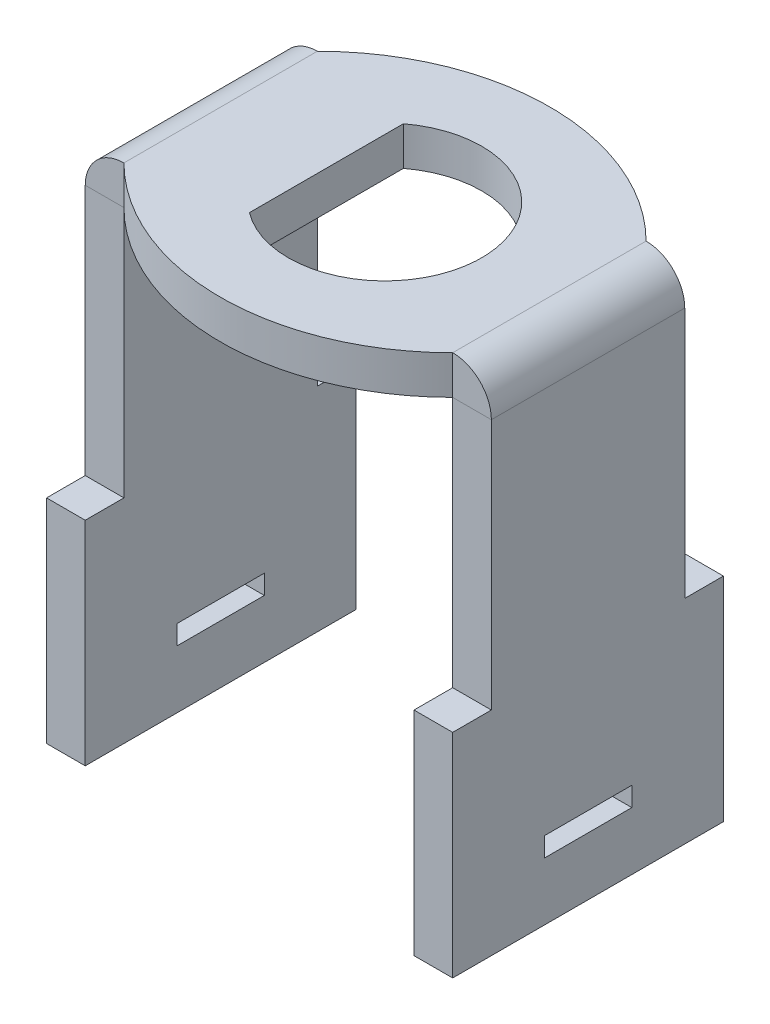
ISO-10303-21;
HEADER;
FILE_DESCRIPTION(('STEP AP214'),'2;1');
FILE_NAME('part.step','',(''),(''),'','','');
FILE_SCHEMA(('AUTOMOTIVE_DESIGN { 1 0 10303 214 1 1 1 1 }'));
ENDSEC;
DATA;
#1=APPLICATION_CONTEXT('core data for automotive mechanical design processes');
#2=APPLICATION_PROTOCOL_DEFINITION('international standard','automotive_design',2000,#1);
#3=PRODUCT_CONTEXT('',#1,'mechanical');
#4=PRODUCT('Part','Part','',(#3));
#5=PRODUCT_RELATED_PRODUCT_CATEGORY('part','',(#4));
#6=PRODUCT_DEFINITION_FORMATION('','',#4);
#7=PRODUCT_DEFINITION_CONTEXT('part definition',#1,'design');
#8=PRODUCT_DEFINITION('design','',#6,#7);
#9=PRODUCT_DEFINITION_SHAPE('','',#8);
#10=(LENGTH_UNIT() NAMED_UNIT(*) SI_UNIT(.MILLI.,.METRE.));
#11=(NAMED_UNIT(*) PLANE_ANGLE_UNIT() SI_UNIT($,.RADIAN.));
#12=(NAMED_UNIT(*) SI_UNIT($,.STERADIAN.) SOLID_ANGLE_UNIT());
#13=UNCERTAINTY_MEASURE_WITH_UNIT(LENGTH_MEASURE(1.E-05),#10,'distance_accuracy_value','');
#14=(GEOMETRIC_REPRESENTATION_CONTEXT(3) GLOBAL_UNCERTAINTY_ASSIGNED_CONTEXT((#13)) GLOBAL_UNIT_ASSIGNED_CONTEXT((#10,
#11,#12)) REPRESENTATION_CONTEXT('',''));
#15=CARTESIAN_POINT('',(0.,0.,0.));
#16=DIRECTION('',(0.,0.,1.));
#17=DIRECTION('',(1.,0.,0.));
#18=AXIS2_PLACEMENT_3D('',#15,#16,#17);
#19=CARTESIAN_POINT('',(-7.5,0.,10.));
#20=DIRECTION('',(0.,1.,0.));
#21=DIRECTION('',(0.,0.,1.));
#22=AXIS2_PLACEMENT_3D('',#19,#20,#21);
#23=PLANE('',#22);
#24=CARTESIAN_POINT('',(2.99999999999999,0.,5.));
#25=DIRECTION('',(0.,1.,0.));
#26=DIRECTION('',(0.,0.,1.));
#27=AXIS2_PLACEMENT_3D('',#24,#25,#26);
#28=CIRCLE('',#27,5.);
#29=CARTESIAN_POINT('',(-0.0291733819532871,0.,8.97795281797884));
#30=VERTEX_POINT('',#29);
#31=CARTESIAN_POINT('',(-0.0291733819532871,0.,1.02204718202116));
#32=VERTEX_POINT('',#31);
#33=EDGE_CURVE('E326',#30,#32,#28,.T.);
#34=ORIENTED_EDGE('',*,*,#33,.F.);
#35=DIRECTION('',(0.,0.,-1.));
#36=VECTOR('',#35,1.);
#37=CARTESIAN_POINT('',(-0.0291733819532871,0.,8.97795281797884));
#38=LINE('',#37,#36);
#39=EDGE_CURVE('E1022',#30,#32,#38,.T.);
#40=ORIENTED_EDGE('',*,*,#39,.T.);
#41=EDGE_LOOP('',(#34,#40));
#42=FACE_BOUND('',#41,.T.);
#43=CARTESIAN_POINT('',(2.99999999999999,0.,8.50000000000013));
#44=DIRECTION('',(0.,-1.,0.));
#45=DIRECTION('',(0.,0.,-1.));
#46=AXIS2_PLACEMENT_3D('',#43,#44,#45);
#47=CIRCLE('',#46,12.0208152801714);
#48=CARTESIAN_POINT('',(-5.5,0.,0.));
#49=VERTEX_POINT('',#48);
#50=CARTESIAN_POINT('',(11.5,0.,0.));
#51=VERTEX_POINT('',#50);
#52=EDGE_CURVE('E243',#49,#51,#47,.T.);
#53=ORIENTED_EDGE('',*,*,#52,.F.);
#54=DIRECTION('',(0.,0.,-1.));
#55=VECTOR('',#54,1.);
#56=CARTESIAN_POINT('',(-5.50000000000001,0.,10.));
#57=LINE('',#56,#55);
#58=CARTESIAN_POINT('',(-5.5,0.,10.));
#59=VERTEX_POINT('',#58);
#60=EDGE_CURVE('E259',#59,#49,#57,.T.);
#61=ORIENTED_EDGE('',*,*,#60,.F.);
#62=CARTESIAN_POINT('',(2.99999999999999,0.,1.49999999999987));
#63=DIRECTION('',(0.,-1.,0.));
#64=DIRECTION('',(0.,0.,1.));
#65=AXIS2_PLACEMENT_3D('',#62,#63,#64);
#66=CIRCLE('',#65,12.0208152801714);
#67=CARTESIAN_POINT('',(11.5,0.,10.));
#68=VERTEX_POINT('',#67);
#69=EDGE_CURVE('E1029',#68,#59,#66,.T.);
#70=ORIENTED_EDGE('',*,*,#69,.F.);
#71=DIRECTION('',(0.,0.,-1.));
#72=VECTOR('',#71,1.);
#73=CARTESIAN_POINT('',(11.5,0.,10.));
#74=LINE('',#73,#72);
#75=EDGE_CURVE('E262',#68,#51,#74,.T.);
#76=ORIENTED_EDGE('',*,*,#75,.T.);
#77=EDGE_LOOP('',(#53,#61,#70,#76));
#78=FACE_BOUND('',#77,.T.);
#79=ADVANCED_FACE('F41',(#42,#78),#23,.T.);
#80=CARTESIAN_POINT('',(-7.5,-2.,10.));
#81=DIRECTION('',(0.,1.,0.));
#82=DIRECTION('',(0.,0.,1.));
#83=AXIS2_PLACEMENT_3D('',#80,#81,#82);
#84=PLANE('',#83);
#85=CARTESIAN_POINT('',(2.99999999999999,-2.,5.));
#86=DIRECTION('',(0.,1.,0.));
#87=DIRECTION('',(0.,0.,1.));
#88=AXIS2_PLACEMENT_3D('',#85,#86,#87);
#89=CIRCLE('',#88,5.);
#90=CARTESIAN_POINT('',(-0.0291733819532871,-2.,8.97795281797884));
#91=VERTEX_POINT('',#90);
#92=CARTESIAN_POINT('',(-0.0291733819532871,-2.,1.02204718202116));
#93=VERTEX_POINT('',#92);
#94=EDGE_CURVE('E322',#91,#93,#89,.T.);
#95=ORIENTED_EDGE('',*,*,#94,.T.);
#96=DIRECTION('',(0.,0.,-1.));
#97=VECTOR('',#96,1.);
#98=CARTESIAN_POINT('',(-0.0291733819532871,-2.,8.97795281797884));
#99=LINE('',#98,#97);
#100=EDGE_CURVE('E1024',#91,#93,#99,.T.);
#101=ORIENTED_EDGE('',*,*,#100,.F.);
#102=EDGE_LOOP('',(#95,#101));
#103=FACE_BOUND('',#102,.T.);
#104=DIRECTION('',(0.,0.,-1.));
#105=VECTOR('',#104,1.);
#106=CARTESIAN_POINT('',(-5.5,-2.,10.));
#107=LINE('',#106,#105);
#108=CARTESIAN_POINT('',(-5.5,-2.,10.));
#109=VERTEX_POINT('',#108);
#110=CARTESIAN_POINT('',(-5.5,-2.,0.));
#111=VERTEX_POINT('',#110);
#112=EDGE_CURVE('E291',#109,#111,#107,.T.);
#113=ORIENTED_EDGE('',*,*,#112,.T.);
#114=CARTESIAN_POINT('',(2.99999999999999,-2.,8.50000000000013));
#115=DIRECTION('',(0.,1.,0.));
#116=DIRECTION('',(0.,0.,1.));
#117=AXIS2_PLACEMENT_3D('',#114,#115,#116);
#118=CIRCLE('',#117,12.0208152801714);
#119=CARTESIAN_POINT('',(11.5,-2.,0.));
#120=VERTEX_POINT('',#119);
#121=EDGE_CURVE('E246',#111,#120,#118,.F.);
#122=ORIENTED_EDGE('',*,*,#121,.T.);
#123=DIRECTION('',(0.,0.,-1.));
#124=VECTOR('',#123,1.);
#125=CARTESIAN_POINT('',(11.5,-2.,10.));
#126=LINE('',#125,#124);
#127=CARTESIAN_POINT('',(11.5,-2.,10.));
#128=VERTEX_POINT('',#127);
#129=EDGE_CURVE('E288',#128,#120,#126,.T.);
#130=ORIENTED_EDGE('',*,*,#129,.F.);
#131=CARTESIAN_POINT('',(2.99999999999999,-2.,1.49999999999987));
#132=DIRECTION('',(0.,1.,0.));
#133=DIRECTION('',(0.,0.,1.));
#134=AXIS2_PLACEMENT_3D('',#131,#132,#133);
#135=CIRCLE('',#134,12.0208152801714);
#136=EDGE_CURVE('E504',#128,#109,#135,.F.);
#137=ORIENTED_EDGE('',*,*,#136,.T.);
#138=EDGE_LOOP('',(#113,#122,#130,#137));
#139=FACE_BOUND('',#138,.T.);
#140=ADVANCED_FACE('F503',(#103,#139),#84,.F.);
#141=CARTESIAN_POINT('',(11.5,0.,10.));
#142=DIRECTION('',(1.,0.,0.));
#143=DIRECTION('',(0.,1.,0.));
#144=AXIS2_PLACEMENT_3D('',#141,#142,#143);
#145=PLANE('',#144);
#146=DIRECTION('',(0.,-1.,0.));
#147=VECTOR('',#146,1.);
#148=CARTESIAN_POINT('',(11.5,0.,0.));
#149=LINE('',#148,#147);
#150=CARTESIAN_POINT('',(11.5,-9.,0.));
#151=VERTEX_POINT('',#150);
#152=EDGE_CURVE('E478',#120,#151,#149,.T.);
#153=ORIENTED_EDGE('',*,*,#152,.T.);
#154=CARTESIAN_POINT('',(11.5,-15.,0.));
#155=VERTEX_POINT('',#154);
#156=EDGE_CURVE('E64',#151,#155,#149,.T.);
#157=ORIENTED_EDGE('',*,*,#156,.T.);
#158=DIRECTION('',(0.,0.,1.));
#159=VECTOR('',#158,1.);
#160=CARTESIAN_POINT('',(11.5,-15.,0.));
#161=LINE('',#160,#159);
#162=CARTESIAN_POINT('',(11.5,-15.,-2.));
#163=VERTEX_POINT('',#162);
#164=EDGE_CURVE('E447',#163,#155,#161,.T.);
#165=ORIENTED_EDGE('',*,*,#164,.F.);
#166=DIRECTION('',(0.,1.,0.));
#167=VECTOR('',#166,1.);
#168=CARTESIAN_POINT('',(11.5,-15.,-2.));
#169=LINE('',#168,#167);
#170=CARTESIAN_POINT('',(11.5,-26.,-2.));
#171=VERTEX_POINT('',#170);
#172=EDGE_CURVE('E444',#171,#163,#169,.T.);
#173=ORIENTED_EDGE('',*,*,#172,.F.);
#174=DIRECTION('',(0.,0.,-1.));
#175=VECTOR('',#174,1.);
#176=CARTESIAN_POINT('',(11.5,-26.,10.));
#177=LINE('',#176,#175);
#178=CARTESIAN_POINT('',(11.5,-26.,12.));
#179=VERTEX_POINT('',#178);
#180=EDGE_CURVE('E305',#179,#171,#177,.T.);
#181=ORIENTED_EDGE('',*,*,#180,.F.);
#182=DIRECTION('',(0.,-1.,0.));
#183=VECTOR('',#182,1.);
#184=CARTESIAN_POINT('',(11.5,-15.,12.));
#185=LINE('',#184,#183);
#186=CARTESIAN_POINT('',(11.5,-15.,12.));
#187=VERTEX_POINT('',#186);
#188=EDGE_CURVE('E424',#187,#179,#185,.T.);
#189=ORIENTED_EDGE('',*,*,#188,.F.);
#190=DIRECTION('',(0.,0.,1.));
#191=VECTOR('',#190,1.);
#192=CARTESIAN_POINT('',(11.5,-15.,10.));
#193=LINE('',#192,#191);
#194=CARTESIAN_POINT('',(11.5,-15.,10.));
#195=VERTEX_POINT('',#194);
#196=EDGE_CURVE('E427',#195,#187,#193,.T.);
#197=ORIENTED_EDGE('',*,*,#196,.F.);
#198=DIRECTION('',(0.,-1.,0.));
#199=VECTOR('',#198,1.);
#200=CARTESIAN_POINT('',(11.5,0.,10.));
#201=LINE('',#200,#199);
#202=CARTESIAN_POINT('',(11.5,-9.,10.));
#203=VERTEX_POINT('',#202);
#204=EDGE_CURVE('E287',#203,#195,#201,.T.);
#205=ORIENTED_EDGE('',*,*,#204,.F.);
#206=EDGE_CURVE('E463',#128,#203,#201,.T.);
#207=ORIENTED_EDGE('',*,*,#206,.F.);
#208=ORIENTED_EDGE('',*,*,#129,.T.);
#209=EDGE_LOOP('',(#153,#157,#165,#173,#181,#189,#197,#205,#207,#208));
#210=FACE_BOUND('',#209,.T.);
#211=DIRECTION('',(0.,0.,1.));
#212=VECTOR('',#211,1.);
#213=CARTESIAN_POINT('',(11.5,-23.,10.));
#214=LINE('',#213,#212);
#215=CARTESIAN_POINT('',(11.5,-23.,2.73773179975743));
#216=VERTEX_POINT('',#215);
#217=CARTESIAN_POINT('',(11.5,-23.,7.26226820024256));
#218=VERTEX_POINT('',#217);
#219=EDGE_CURVE('E383',#216,#218,#214,.T.);
#220=ORIENTED_EDGE('',*,*,#219,.F.);
#221=DIRECTION('',(0.,-1.,0.));
#222=VECTOR('',#221,1.);
#223=CARTESIAN_POINT('',(11.5,0.,2.73773179975746));
#224=LINE('',#223,#222);
#225=CARTESIAN_POINT('',(11.5,-22.,2.73773179975743));
#226=VERTEX_POINT('',#225);
#227=EDGE_CURVE('E372',#226,#216,#224,.T.);
#228=ORIENTED_EDGE('',*,*,#227,.F.);
#229=DIRECTION('',(0.,0.,-1.));
#230=VECTOR('',#229,1.);
#231=CARTESIAN_POINT('',(11.5,-22.,10.));
#232=LINE('',#231,#230);
#233=CARTESIAN_POINT('',(11.5,-22.,7.26226820024256));
#234=VERTEX_POINT('',#233);
#235=EDGE_CURVE('E375',#234,#226,#232,.T.);
#236=ORIENTED_EDGE('',*,*,#235,.F.);
#237=DIRECTION('',(0.,1.,0.));
#238=VECTOR('',#237,1.);
#239=CARTESIAN_POINT('',(11.5,0.,7.26226820024256));
#240=LINE('',#239,#238);
#241=EDGE_CURVE('E380',#218,#234,#240,.T.);
#242=ORIENTED_EDGE('',*,*,#241,.F.);
#243=EDGE_LOOP('',(#220,#228,#236,#242));
#244=FACE_BOUND('',#243,.T.);
#245=ADVANCED_FACE('F496',(#210,#244),#145,.F.);
#246=CARTESIAN_POINT('',(13.5,0.,10.));
#247=DIRECTION('',(1.,0.,0.));
#248=DIRECTION('',(0.,1.,0.));
#249=AXIS2_PLACEMENT_3D('',#246,#247,#248);
#250=PLANE('',#249);
#251=DIRECTION('',(0.,-1.,0.));
#252=VECTOR('',#251,1.);
#253=CARTESIAN_POINT('',(13.5,0.,0.));
#254=LINE('',#253,#252);
#255=CARTESIAN_POINT('',(13.5,-2.,0.));
#256=VERTEX_POINT('',#255);
#257=CARTESIAN_POINT('',(13.5,-15.,0.));
#258=VERTEX_POINT('',#257);
#259=EDGE_CURVE('E281',#256,#258,#254,.T.);
#260=ORIENTED_EDGE('',*,*,#259,.F.);
#261=DIRECTION('',(0.,0.,-1.));
#262=VECTOR('',#261,1.);
#263=CARTESIAN_POINT('',(13.5,-2.,10.));
#264=LINE('',#263,#262);
#265=CARTESIAN_POINT('',(13.5,-2.,10.));
#266=VERTEX_POINT('',#265);
#267=EDGE_CURVE('E300',#266,#256,#264,.T.);
#268=ORIENTED_EDGE('',*,*,#267,.F.);
#269=DIRECTION('',(0.,-1.,0.));
#270=VECTOR('',#269,1.);
#271=CARTESIAN_POINT('',(13.5,0.,10.));
#272=LINE('',#271,#270);
#273=CARTESIAN_POINT('',(13.5,-15.,10.));
#274=VERTEX_POINT('',#273);
#275=EDGE_CURVE('E466',#266,#274,#272,.T.);
#276=ORIENTED_EDGE('',*,*,#275,.T.);
#277=DIRECTION('',(0.,0.,1.));
#278=VECTOR('',#277,1.);
#279=CARTESIAN_POINT('',(13.5,-15.,10.));
#280=LINE('',#279,#278);
#281=CARTESIAN_POINT('',(13.5,-15.,12.));
#282=VERTEX_POINT('',#281);
#283=EDGE_CURVE('E428',#274,#282,#280,.T.);
#284=ORIENTED_EDGE('',*,*,#283,.T.);
#285=DIRECTION('',(0.,-1.,0.));
#286=VECTOR('',#285,1.);
#287=CARTESIAN_POINT('',(13.5,-15.,12.));
#288=LINE('',#287,#286);
#289=CARTESIAN_POINT('',(13.5,-26.,12.));
#290=VERTEX_POINT('',#289);
#291=EDGE_CURVE('E419',#282,#290,#288,.T.);
#292=ORIENTED_EDGE('',*,*,#291,.T.);
#293=DIRECTION('',(0.,0.,-1.));
#294=VECTOR('',#293,1.);
#295=CARTESIAN_POINT('',(13.5,-26.,10.));
#296=LINE('',#295,#294);
#297=CARTESIAN_POINT('',(13.5,-26.,-2.));
#298=VERTEX_POINT('',#297);
#299=EDGE_CURVE('E303',#290,#298,#296,.T.);
#300=ORIENTED_EDGE('',*,*,#299,.T.);
#301=DIRECTION('',(0.,1.,0.));
#302=VECTOR('',#301,1.);
#303=CARTESIAN_POINT('',(13.5,-15.,-2.));
#304=LINE('',#303,#302);
#305=CARTESIAN_POINT('',(13.5,-15.,-2.));
#306=VERTEX_POINT('',#305);
#307=EDGE_CURVE('E438',#298,#306,#304,.T.);
#308=ORIENTED_EDGE('',*,*,#307,.T.);
#309=DIRECTION('',(0.,0.,1.));
#310=VECTOR('',#309,1.);
#311=CARTESIAN_POINT('',(13.5,-15.,0.));
#312=LINE('',#311,#310);
#313=EDGE_CURVE('E448',#306,#258,#312,.T.);
#314=ORIENTED_EDGE('',*,*,#313,.T.);
#315=EDGE_LOOP('',(#260,#268,#276,#284,#292,#300,#308,#314));
#316=FACE_BOUND('',#315,.T.);
#317=DIRECTION('',(0.,-1.,0.));
#318=VECTOR('',#317,1.);
#319=CARTESIAN_POINT('',(13.5,-22.,2.73773179975743));
#320=LINE('',#319,#318);
#321=CARTESIAN_POINT('',(13.5,-22.,2.73773179975743));
#322=VERTEX_POINT('',#321);
#323=CARTESIAN_POINT('',(13.5,-23.,2.73773179975743));
#324=VERTEX_POINT('',#323);
#325=EDGE_CURVE('E1040',#322,#324,#320,.T.);
#326=ORIENTED_EDGE('',*,*,#325,.T.);
#327=DIRECTION('',(0.,0.,1.));
#328=VECTOR('',#327,1.);
#329=CARTESIAN_POINT('',(13.5,-23.,2.73773179975743));
#330=LINE('',#329,#328);
#331=CARTESIAN_POINT('',(13.5,-23.,7.26226820024256));
#332=VERTEX_POINT('',#331);
#333=EDGE_CURVE('E1025',#324,#332,#330,.T.);
#334=ORIENTED_EDGE('',*,*,#333,.T.);
#335=DIRECTION('',(0.,1.,0.));
#336=VECTOR('',#335,1.);
#337=CARTESIAN_POINT('',(13.5,-23.,7.26226820024256));
#338=LINE('',#337,#336);
#339=CARTESIAN_POINT('',(13.5,-22.,7.26226820024256));
#340=VERTEX_POINT('',#339);
#341=EDGE_CURVE('E1035',#332,#340,#338,.T.);
#342=ORIENTED_EDGE('',*,*,#341,.T.);
#343=DIRECTION('',(0.,0.,-1.));
#344=VECTOR('',#343,1.);
#345=CARTESIAN_POINT('',(13.5,-22.,7.26226820024256));
#346=LINE('',#345,#344);
#347=EDGE_CURVE('E1038',#340,#322,#346,.T.);
#348=ORIENTED_EDGE('',*,*,#347,.T.);
#349=EDGE_LOOP('',(#326,#334,#342,#348));
#350=FACE_BOUND('',#349,.T.);
#351=ADVANCED_FACE('F488',(#316,#350),#250,.T.);
#352=CARTESIAN_POINT('',(-7.5,0.,10.));
#353=DIRECTION('',(-1.,0.,0.));
#354=DIRECTION('',(0.,-1.,0.));
#355=AXIS2_PLACEMENT_3D('',#352,#353,#354);
#356=PLANE('',#355);
#357=DIRECTION('',(0.,1.,0.));
#358=VECTOR('',#357,1.);
#359=CARTESIAN_POINT('',(-7.5,0.,0.));
#360=LINE('',#359,#358);
#361=CARTESIAN_POINT('',(-7.5,-15.,0.));
#362=VERTEX_POINT('',#361);
#363=CARTESIAN_POINT('',(-7.5,-2.,0.));
#364=VERTEX_POINT('',#363);
#365=EDGE_CURVE('E276',#362,#364,#360,.T.);
#366=ORIENTED_EDGE('',*,*,#365,.F.);
#367=DIRECTION('',(0.,0.,-1.));
#368=VECTOR('',#367,1.);
#369=CARTESIAN_POINT('',(-7.5,-15.,0.));
#370=LINE('',#369,#368);
#371=CARTESIAN_POINT('',(-7.5,-15.,-2.));
#372=VERTEX_POINT('',#371);
#373=EDGE_CURVE('E399',#362,#372,#370,.T.);
#374=ORIENTED_EDGE('',*,*,#373,.T.);
#375=DIRECTION('',(0.,-1.,0.));
#376=VECTOR('',#375,1.);
#377=CARTESIAN_POINT('',(-7.5,-15.,-2.));
#378=LINE('',#377,#376);
#379=CARTESIAN_POINT('',(-7.5,-26.,-2.));
#380=VERTEX_POINT('',#379);
#381=EDGE_CURVE('E408',#372,#380,#378,.T.);
#382=ORIENTED_EDGE('',*,*,#381,.T.);
#383=DIRECTION('',(0.,0.,-1.));
#384=VECTOR('',#383,1.);
#385=CARTESIAN_POINT('',(-7.5,-26.,10.));
#386=LINE('',#385,#384);
#387=CARTESIAN_POINT('',(-7.5,-26.,12.));
#388=VERTEX_POINT('',#387);
#389=EDGE_CURVE('E296',#388,#380,#386,.T.);
#390=ORIENTED_EDGE('',*,*,#389,.F.);
#391=DIRECTION('',(0.,1.,0.));
#392=VECTOR('',#391,1.);
#393=CARTESIAN_POINT('',(-7.5,-15.,12.));
#394=LINE('',#393,#392);
#395=CARTESIAN_POINT('',(-7.5,-15.,12.));
#396=VERTEX_POINT('',#395);
#397=EDGE_CURVE('E325',#388,#396,#394,.T.);
#398=ORIENTED_EDGE('',*,*,#397,.T.);
#399=DIRECTION('',(0.,0.,-1.));
#400=VECTOR('',#399,1.);
#401=CARTESIAN_POINT('',(-7.5,-15.,10.));
#402=LINE('',#401,#400);
#403=CARTESIAN_POINT('',(-7.5,-15.,10.));
#404=VERTEX_POINT('',#403);
#405=EDGE_CURVE('E390',#396,#404,#402,.T.);
#406=ORIENTED_EDGE('',*,*,#405,.T.);
#407=DIRECTION('',(0.,1.,0.));
#408=VECTOR('',#407,1.);
#409=CARTESIAN_POINT('',(-7.5,0.,10.));
#410=LINE('',#409,#408);
#411=CARTESIAN_POINT('',(-7.5,-2.,10.));
#412=VERTEX_POINT('',#411);
#413=EDGE_CURVE('E473',#404,#412,#410,.T.);
#414=ORIENTED_EDGE('',*,*,#413,.T.);
#415=DIRECTION('',(0.,0.,-1.));
#416=VECTOR('',#415,1.);
#417=CARTESIAN_POINT('',(-7.5,-2.,10.));
#418=LINE('',#417,#416);
#419=EDGE_CURVE('E272',#412,#364,#418,.T.);
#420=ORIENTED_EDGE('',*,*,#419,.T.);
#421=EDGE_LOOP('',(#366,#374,#382,#390,#398,#406,#414,#420));
#422=FACE_BOUND('',#421,.T.);
#423=DIRECTION('',(0.,-1.,0.));
#424=VECTOR('',#423,1.);
#425=CARTESIAN_POINT('',(-7.5,0.,7.26226820024256));
#426=LINE('',#425,#424);
#427=CARTESIAN_POINT('',(-7.5,-22.,7.26226820024256));
#428=VERTEX_POINT('',#427);
#429=CARTESIAN_POINT('',(-7.5,-23.,7.26226820024256));
#430=VERTEX_POINT('',#429);
#431=EDGE_CURVE('E378',#428,#430,#426,.T.);
#432=ORIENTED_EDGE('',*,*,#431,.T.);
#433=DIRECTION('',(0.,0.,-1.));
#434=VECTOR('',#433,1.);
#435=CARTESIAN_POINT('',(-7.5,-23.,10.));
#436=LINE('',#435,#434);
#437=CARTESIAN_POINT('',(-7.5,-23.,2.73773179975743));
#438=VERTEX_POINT('',#437);
#439=EDGE_CURVE('E347',#430,#438,#436,.T.);
#440=ORIENTED_EDGE('',*,*,#439,.T.);
#441=DIRECTION('',(0.,1.,0.));
#442=VECTOR('',#441,1.);
#443=CARTESIAN_POINT('',(-7.5,0.,2.73773179975746));
#444=LINE('',#443,#442);
#445=CARTESIAN_POINT('',(-7.5,-22.,2.73773179975743));
#446=VERTEX_POINT('',#445);
#447=EDGE_CURVE('E348',#438,#446,#444,.T.);
#448=ORIENTED_EDGE('',*,*,#447,.T.);
#449=DIRECTION('',(0.,0.,1.));
#450=VECTOR('',#449,1.);
#451=CARTESIAN_POINT('',(-7.5,-22.,10.));
#452=LINE('',#451,#450);
#453=EDGE_CURVE('E361',#446,#428,#452,.T.);
#454=ORIENTED_EDGE('',*,*,#453,.T.);
#455=EDGE_LOOP('',(#432,#440,#448,#454));
#456=FACE_BOUND('',#455,.T.);
#457=ADVANCED_FACE('F547',(#422,#456),#356,.T.);
#458=CARTESIAN_POINT('',(-5.5,0.,10.));
#459=DIRECTION('',(-1.,0.,0.));
#460=DIRECTION('',(0.,-1.,0.));
#461=AXIS2_PLACEMENT_3D('',#458,#459,#460);
#462=PLANE('',#461);
#463=DIRECTION('',(0.,0.,-1.));
#464=VECTOR('',#463,1.);
#465=CARTESIAN_POINT('',(-5.5,-26.,10.));
#466=LINE('',#465,#464);
#467=CARTESIAN_POINT('',(-5.5,-26.,12.));
#468=VERTEX_POINT('',#467);
#469=CARTESIAN_POINT('',(-5.5,-26.,-2.));
#470=VERTEX_POINT('',#469);
#471=EDGE_CURVE('E294',#468,#470,#466,.T.);
#472=ORIENTED_EDGE('',*,*,#471,.T.);
#473=DIRECTION('',(0.,-1.,0.));
#474=VECTOR('',#473,1.);
#475=CARTESIAN_POINT('',(-5.5,-15.,-2.));
#476=LINE('',#475,#474);
#477=CARTESIAN_POINT('',(-5.5,-15.,-2.));
#478=VERTEX_POINT('',#477);
#479=EDGE_CURVE('E407',#478,#470,#476,.T.);
#480=ORIENTED_EDGE('',*,*,#479,.F.);
#481=DIRECTION('',(0.,0.,-1.));
#482=VECTOR('',#481,1.);
#483=CARTESIAN_POINT('',(-5.5,-15.,0.));
#484=LINE('',#483,#482);
#485=CARTESIAN_POINT('',(-5.5,-15.,0.));
#486=VERTEX_POINT('',#485);
#487=EDGE_CURVE('E404',#486,#478,#484,.T.);
#488=ORIENTED_EDGE('',*,*,#487,.F.);
#489=DIRECTION('',(0.,1.,0.));
#490=VECTOR('',#489,1.);
#491=CARTESIAN_POINT('',(-5.5,0.,0.));
#492=LINE('',#491,#490);
#493=CARTESIAN_POINT('',(-5.5,-9.,0.));
#494=VERTEX_POINT('',#493);
#495=EDGE_CURVE('E285',#486,#494,#492,.T.);
#496=ORIENTED_EDGE('',*,*,#495,.T.);
#497=EDGE_CURVE('E56',#494,#111,#492,.T.);
#498=ORIENTED_EDGE('',*,*,#497,.T.);
#499=ORIENTED_EDGE('',*,*,#112,.F.);
#500=DIRECTION('',(0.,1.,0.));
#501=VECTOR('',#500,1.);
#502=CARTESIAN_POINT('',(-5.5,0.,10.));
#503=LINE('',#502,#501);
#504=CARTESIAN_POINT('',(-5.5,-9.,10.));
#505=VERTEX_POINT('',#504);
#506=EDGE_CURVE('E475',#505,#109,#503,.T.);
#507=ORIENTED_EDGE('',*,*,#506,.F.);
#508=CARTESIAN_POINT('',(-5.5,-15.,10.));
#509=VERTEX_POINT('',#508);
#510=EDGE_CURVE('E292',#509,#505,#503,.T.);
#511=ORIENTED_EDGE('',*,*,#510,.F.);
#512=DIRECTION('',(0.,0.,-1.));
#513=VECTOR('',#512,1.);
#514=CARTESIAN_POINT('',(-5.5,-15.,10.));
#515=LINE('',#514,#513);
#516=CARTESIAN_POINT('',(-5.5,-15.,12.));
#517=VERTEX_POINT('',#516);
#518=EDGE_CURVE('E389',#517,#509,#515,.T.);
#519=ORIENTED_EDGE('',*,*,#518,.F.);
#520=DIRECTION('',(0.,1.,0.));
#521=VECTOR('',#520,1.);
#522=CARTESIAN_POINT('',(-5.5,-15.,12.));
#523=LINE('',#522,#521);
#524=EDGE_CURVE('E386',#468,#517,#523,.T.);
#525=ORIENTED_EDGE('',*,*,#524,.F.);
#526=EDGE_LOOP('',(#472,#480,#488,#496,#498,#499,#507,#511,#519,#525));
#527=FACE_BOUND('',#526,.T.);
#528=DIRECTION('',(0.,0.,-1.));
#529=VECTOR('',#528,1.);
#530=CARTESIAN_POINT('',(-5.5,-23.,10.));
#531=LINE('',#530,#529);
#532=CARTESIAN_POINT('',(-5.5,-23.,7.26226820024256));
#533=VERTEX_POINT('',#532);
#534=CARTESIAN_POINT('',(-5.5,-23.,2.73773179975743));
#535=VERTEX_POINT('',#534);
#536=EDGE_CURVE('E11',#533,#535,#531,.T.);
#537=ORIENTED_EDGE('',*,*,#536,.F.);
#538=DIRECTION('',(0.,-1.,0.));
#539=VECTOR('',#538,1.);
#540=CARTESIAN_POINT('',(-5.5,0.,7.26226820024256));
#541=LINE('',#540,#539);
#542=CARTESIAN_POINT('',(-5.5,-22.,7.26226820024256));
#543=VERTEX_POINT('',#542);
#544=EDGE_CURVE('E49',#543,#533,#541,.T.);
#545=ORIENTED_EDGE('',*,*,#544,.F.);
#546=DIRECTION('',(0.,0.,1.));
#547=VECTOR('',#546,1.);
#548=CARTESIAN_POINT('',(-5.5,-22.,10.));
#549=LINE('',#548,#547);
#550=CARTESIAN_POINT('',(-5.5,-22.,2.73773179975743));
#551=VERTEX_POINT('',#550);
#552=EDGE_CURVE('E328',#551,#543,#549,.T.);
#553=ORIENTED_EDGE('',*,*,#552,.F.);
#554=DIRECTION('',(0.,1.,0.));
#555=VECTOR('',#554,1.);
#556=CARTESIAN_POINT('',(-5.5,0.,2.73773179975746));
#557=LINE('',#556,#555);
#558=EDGE_CURVE('E321',#535,#551,#557,.T.);
#559=ORIENTED_EDGE('',*,*,#558,.F.);
#560=EDGE_LOOP('',(#537,#545,#553,#559));
#561=FACE_BOUND('',#560,.T.);
#562=ADVANCED_FACE('F351',(#527,#561),#462,.F.);
#563=CARTESIAN_POINT('',(-5.5,-2.,10.));
#564=DIRECTION('',(0.,0.,1.));
#565=DIRECTION('',(1.,0.,0.));
#566=AXIS2_PLACEMENT_3D('',#563,#564,#565);
#567=PLANE('',#566);
#568=DIRECTION('',(-1.,0.,0.));
#569=VECTOR('',#568,1.);
#570=CARTESIAN_POINT('',(-5.5,-2.,10.));
#571=LINE('',#570,#569);
#572=EDGE_CURVE('E315',#109,#412,#571,.T.);
#573=ORIENTED_EDGE('',*,*,#572,.F.);
#574=DIRECTION('',(0.,1.,0.));
#575=VECTOR('',#574,1.);
#576=CARTESIAN_POINT('',(-5.5,-2.,10.));
#577=LINE('',#576,#575);
#578=EDGE_CURVE('E318',#109,#59,#577,.T.);
#579=ORIENTED_EDGE('',*,*,#578,.T.);
#580=CARTESIAN_POINT('',(-5.5,-2.,10.));
#581=DIRECTION('',(0.,0.,1.));
#582=DIRECTION('',(1.,0.,0.));
#583=AXIS2_PLACEMENT_3D('',#580,#581,#582);
#584=CIRCLE('',#583,2.);
#585=EDGE_CURVE('E271',#412,#59,#584,.F.);
#586=ORIENTED_EDGE('',*,*,#585,.F.);
#587=EDGE_LOOP('',(#573,#579,#586));
#588=FACE_BOUND('',#587,.T.);
#589=ADVANCED_FACE('F43',(#588),#567,.T.);
#590=CARTESIAN_POINT('',(-5.5,-2.,0.));
#591=DIRECTION('',(0.,0.,-1.));
#592=DIRECTION('',(-1.,0.,0.));
#593=AXIS2_PLACEMENT_3D('',#590,#591,#592);
#594=PLANE('',#593);
#595=DIRECTION('',(-1.,0.,0.));
#596=VECTOR('',#595,1.);
#597=CARTESIAN_POINT('',(-5.5,-15.,0.));
#598=LINE('',#597,#596);
#599=EDGE_CURVE('E411',#486,#362,#598,.T.);
#600=ORIENTED_EDGE('',*,*,#599,.T.);
#601=ORIENTED_EDGE('',*,*,#365,.T.);
#602=DIRECTION('',(-1.,0.,0.));
#603=VECTOR('',#602,1.);
#604=CARTESIAN_POINT('',(-5.5,-2.,0.));
#605=LINE('',#604,#603);
#606=EDGE_CURVE('E251',#111,#364,#605,.T.);
#607=ORIENTED_EDGE('',*,*,#606,.F.);
#608=ORIENTED_EDGE('',*,*,#497,.F.);
#609=ORIENTED_EDGE('',*,*,#495,.F.);
#610=EDGE_LOOP('',(#600,#601,#607,#608,#609));
#611=FACE_BOUND('',#610,.T.);
#612=ADVANCED_FACE('F574',(#611),#594,.T.);
#613=CARTESIAN_POINT('',(-5.5,-2.,0.));
#614=DIRECTION('',(0.,0.,-1.));
#615=DIRECTION('',(-1.,0.,0.));
#616=AXIS2_PLACEMENT_3D('',#613,#614,#615);
#617=PLANE('',#616);
#618=DIRECTION('',(0.,1.,0.));
#619=VECTOR('',#618,1.);
#620=CARTESIAN_POINT('',(-5.5,-2.,0.));
#621=LINE('',#620,#619);
#622=EDGE_CURVE('E240',#111,#49,#621,.T.);
#623=ORIENTED_EDGE('',*,*,#622,.F.);
#624=ORIENTED_EDGE('',*,*,#606,.T.);
#625=CARTESIAN_POINT('',(-5.5,-2.,0.));
#626=DIRECTION('',(0.,0.,1.));
#627=DIRECTION('',(1.,0.,0.));
#628=AXIS2_PLACEMENT_3D('',#625,#626,#627);
#629=CIRCLE('',#628,2.);
#630=EDGE_CURVE('E269',#364,#49,#629,.F.);
#631=ORIENTED_EDGE('',*,*,#630,.T.);
#632=EDGE_LOOP('',(#623,#624,#631));
#633=FACE_BOUND('',#632,.T.);
#634=ADVANCED_FACE('F274',(#633),#617,.T.);
#635=CARTESIAN_POINT('',(11.5,-2.,10.));
#636=DIRECTION('',(0.,0.,1.));
#637=DIRECTION('',(1.,0.,0.));
#638=AXIS2_PLACEMENT_3D('',#635,#636,#637);
#639=PLANE('',#638);
#640=DIRECTION('',(1.,0.,0.));
#641=VECTOR('',#640,1.);
#642=CARTESIAN_POINT('',(11.5,-15.,10.));
#643=LINE('',#642,#641);
#644=EDGE_CURVE('E439',#195,#274,#643,.T.);
#645=ORIENTED_EDGE('',*,*,#644,.T.);
#646=ORIENTED_EDGE('',*,*,#275,.F.);
#647=DIRECTION('',(1.,0.,0.));
#648=VECTOR('',#647,1.);
#649=CARTESIAN_POINT('',(11.5,-2.,10.));
#650=LINE('',#649,#648);
#651=EDGE_CURVE('E252',#128,#266,#650,.T.);
#652=ORIENTED_EDGE('',*,*,#651,.F.);
#653=ORIENTED_EDGE('',*,*,#206,.T.);
#654=ORIENTED_EDGE('',*,*,#204,.T.);
#655=EDGE_LOOP('',(#645,#646,#652,#653,#654));
#656=FACE_BOUND('',#655,.T.);
#657=ADVANCED_FACE('F513',(#656),#639,.T.);
#658=CARTESIAN_POINT('',(11.5,-2.,10.));
#659=DIRECTION('',(0.,0.,1.));
#660=DIRECTION('',(1.,0.,0.));
#661=AXIS2_PLACEMENT_3D('',#658,#659,#660);
#662=PLANE('',#661);
#663=DIRECTION('',(0.,1.,0.));
#664=VECTOR('',#663,1.);
#665=CARTESIAN_POINT('',(11.5,-2.,10.));
#666=LINE('',#665,#664);
#667=EDGE_CURVE('E311',#128,#68,#666,.T.);
#668=ORIENTED_EDGE('',*,*,#667,.F.);
#669=ORIENTED_EDGE('',*,*,#651,.T.);
#670=CARTESIAN_POINT('',(11.5,-2.,10.));
#671=DIRECTION('',(0.,0.,1.));
#672=DIRECTION('',(1.,0.,0.));
#673=AXIS2_PLACEMENT_3D('',#670,#671,#672);
#674=CIRCLE('',#673,2.);
#675=EDGE_CURVE('E469',#68,#266,#674,.F.);
#676=ORIENTED_EDGE('',*,*,#675,.F.);
#677=EDGE_LOOP('',(#668,#669,#676));
#678=FACE_BOUND('',#677,.T.);
#679=ADVANCED_FACE('F509',(#678),#662,.T.);
#680=CARTESIAN_POINT('',(11.5,-2.,0.));
#681=DIRECTION('',(0.,0.,-1.));
#682=DIRECTION('',(-1.,0.,0.));
#683=AXIS2_PLACEMENT_3D('',#680,#681,#682);
#684=PLANE('',#683);
#685=DIRECTION('',(1.,0.,0.));
#686=VECTOR('',#685,1.);
#687=CARTESIAN_POINT('',(11.5,-2.,0.));
#688=LINE('',#687,#686);
#689=EDGE_CURVE('E307',#120,#256,#688,.T.);
#690=ORIENTED_EDGE('',*,*,#689,.F.);
#691=DIRECTION('',(0.,1.,0.));
#692=VECTOR('',#691,1.);
#693=CARTESIAN_POINT('',(11.5,-2.,0.));
#694=LINE('',#693,#692);
#695=EDGE_CURVE('E309',#120,#51,#694,.T.);
#696=ORIENTED_EDGE('',*,*,#695,.T.);
#697=CARTESIAN_POINT('',(11.5,-2.,0.));
#698=DIRECTION('',(0.,0.,1.));
#699=DIRECTION('',(1.,0.,0.));
#700=AXIS2_PLACEMENT_3D('',#697,#698,#699);
#701=CIRCLE('',#700,2.);
#702=EDGE_CURVE('E277',#51,#256,#701,.F.);
#703=ORIENTED_EDGE('',*,*,#702,.T.);
#704=EDGE_LOOP('',(#690,#696,#703));
#705=FACE_BOUND('',#704,.T.);
#706=ADVANCED_FACE('F518',(#705),#684,.T.);
#707=CARTESIAN_POINT('',(13.5,-26.,10.));
#708=DIRECTION('',(0.,-1.,0.));
#709=DIRECTION('',(0.,0.,-1.));
#710=AXIS2_PLACEMENT_3D('',#707,#708,#709);
#711=PLANE('',#710);
#712=ORIENTED_EDGE('',*,*,#180,.T.);
#713=DIRECTION('',(1.,0.,0.));
#714=VECTOR('',#713,1.);
#715=CARTESIAN_POINT('',(11.5,-26.,-2.));
#716=LINE('',#715,#714);
#717=EDGE_CURVE('E451',#171,#298,#716,.T.);
#718=ORIENTED_EDGE('',*,*,#717,.T.);
#719=ORIENTED_EDGE('',*,*,#299,.F.);
#720=DIRECTION('',(1.,0.,0.));
#721=VECTOR('',#720,1.);
#722=CARTESIAN_POINT('',(11.5,-26.,12.));
#723=LINE('',#722,#721);
#724=EDGE_CURVE('E431',#179,#290,#723,.T.);
#725=ORIENTED_EDGE('',*,*,#724,.F.);
#726=EDGE_LOOP('',(#712,#718,#719,#725));
#727=FACE_BOUND('',#726,.T.);
#728=ADVANCED_FACE('F520',(#727),#711,.T.);
#729=CARTESIAN_POINT('',(11.5,-2.,10.));
#730=DIRECTION('',(0.,0.,-1.));
#731=DIRECTION('',(-1.,0.,0.));
#732=AXIS2_PLACEMENT_3D('',#729,#730,#731);
#733=CYLINDRICAL_SURFACE('',#732,2.);
#734=ORIENTED_EDGE('',*,*,#702,.F.);
#735=ORIENTED_EDGE('',*,*,#75,.F.);
#736=ORIENTED_EDGE('',*,*,#675,.T.);
#737=ORIENTED_EDGE('',*,*,#267,.T.);
#738=EDGE_LOOP('',(#734,#735,#736,#737));
#739=FACE_BOUND('',#738,.T.);
#740=ADVANCED_FACE('F516',(#739),#733,.T.);
#741=CARTESIAN_POINT('',(-5.5,-2.,10.));
#742=DIRECTION('',(0.,0.,-1.));
#743=DIRECTION('',(-1.,0.,0.));
#744=AXIS2_PLACEMENT_3D('',#741,#742,#743);
#745=CYLINDRICAL_SURFACE('',#744,2.);
#746=ORIENTED_EDGE('',*,*,#630,.F.);
#747=ORIENTED_EDGE('',*,*,#419,.F.);
#748=ORIENTED_EDGE('',*,*,#585,.T.);
#749=ORIENTED_EDGE('',*,*,#60,.T.);
#750=EDGE_LOOP('',(#746,#747,#748,#749));
#751=FACE_BOUND('',#750,.T.);
#752=ADVANCED_FACE('F267',(#751),#745,.T.);
#753=CARTESIAN_POINT('',(-5.5,-26.,10.));
#754=DIRECTION('',(0.,-1.,0.));
#755=DIRECTION('',(0.,0.,-1.));
#756=AXIS2_PLACEMENT_3D('',#753,#754,#755);
#757=PLANE('',#756);
#758=ORIENTED_EDGE('',*,*,#389,.T.);
#759=DIRECTION('',(-1.,0.,0.));
#760=VECTOR('',#759,1.);
#761=CARTESIAN_POINT('',(-5.5,-26.,-2.));
#762=LINE('',#761,#760);
#763=EDGE_CURVE('E416',#470,#380,#762,.T.);
#764=ORIENTED_EDGE('',*,*,#763,.F.);
#765=ORIENTED_EDGE('',*,*,#471,.F.);
#766=DIRECTION('',(-1.,0.,0.));
#767=VECTOR('',#766,1.);
#768=CARTESIAN_POINT('',(-5.5,-26.,12.));
#769=LINE('',#768,#767);
#770=EDGE_CURVE('E392',#468,#388,#769,.T.);
#771=ORIENTED_EDGE('',*,*,#770,.T.);
#772=EDGE_LOOP('',(#758,#764,#765,#771));
#773=FACE_BOUND('',#772,.T.);
#774=ADVANCED_FACE('F627',(#773),#757,.T.);
#775=CARTESIAN_POINT('',(11.5,-2.,10.));
#776=DIRECTION('',(0.,0.,1.));
#777=DIRECTION('',(1.,0.,0.));
#778=AXIS2_PLACEMENT_3D('',#775,#776,#777);
#779=PLANE('',#778);
#780=DIRECTION('',(-1.,0.,0.));
#781=VECTOR('',#780,1.);
#782=CARTESIAN_POINT('',(-5.5,-15.,10.));
#783=LINE('',#782,#781);
#784=EDGE_CURVE('E396',#509,#404,#783,.T.);
#785=ORIENTED_EDGE('',*,*,#784,.F.);
#786=ORIENTED_EDGE('',*,*,#510,.T.);
#787=ORIENTED_EDGE('',*,*,#506,.T.);
#788=ORIENTED_EDGE('',*,*,#572,.T.);
#789=ORIENTED_EDGE('',*,*,#413,.F.);
#790=EDGE_LOOP('',(#785,#786,#787,#788,#789));
#791=FACE_BOUND('',#790,.T.);
#792=ADVANCED_FACE('F632',(#791),#779,.T.);
#793=CARTESIAN_POINT('',(11.5,-2.,0.));
#794=DIRECTION('',(0.,0.,1.));
#795=DIRECTION('',(1.,0.,0.));
#796=AXIS2_PLACEMENT_3D('',#793,#794,#795);
#797=PLANE('',#796);
#798=ORIENTED_EDGE('',*,*,#259,.T.);
#799=DIRECTION('',(1.,0.,0.));
#800=VECTOR('',#799,1.);
#801=CARTESIAN_POINT('',(11.5,-15.,0.));
#802=LINE('',#801,#800);
#803=EDGE_CURVE('E456',#155,#258,#802,.T.);
#804=ORIENTED_EDGE('',*,*,#803,.F.);
#805=ORIENTED_EDGE('',*,*,#156,.F.);
#806=ORIENTED_EDGE('',*,*,#152,.F.);
#807=ORIENTED_EDGE('',*,*,#689,.T.);
#808=EDGE_LOOP('',(#798,#804,#805,#806,#807));
#809=FACE_BOUND('',#808,.T.);
#810=ADVANCED_FACE('F480',(#809),#797,.F.);
#811=CARTESIAN_POINT('',(11.5,-15.,0.));
#812=DIRECTION('',(0.,1.,0.));
#813=DIRECTION('',(-1.,0.,0.));
#814=AXIS2_PLACEMENT_3D('',#811,#812,#813);
#815=PLANE('',#814);
#816=ORIENTED_EDGE('',*,*,#313,.F.);
#817=DIRECTION('',(1.,0.,0.));
#818=VECTOR('',#817,1.);
#819=CARTESIAN_POINT('',(11.5,-15.,-2.));
#820=LINE('',#819,#818);
#821=EDGE_CURVE('E459',#163,#306,#820,.T.);
#822=ORIENTED_EDGE('',*,*,#821,.F.);
#823=ORIENTED_EDGE('',*,*,#164,.T.);
#824=ORIENTED_EDGE('',*,*,#803,.T.);
#825=EDGE_LOOP('',(#816,#822,#823,#824));
#826=FACE_BOUND('',#825,.T.);
#827=ADVANCED_FACE('F486',(#826),#815,.T.);
#828=CARTESIAN_POINT('',(11.5,-15.,-2.));
#829=DIRECTION('',(0.,0.,-1.));
#830=DIRECTION('',(0.,1.,0.));
#831=AXIS2_PLACEMENT_3D('',#828,#829,#830);
#832=PLANE('',#831);
#833=ORIENTED_EDGE('',*,*,#307,.F.);
#834=ORIENTED_EDGE('',*,*,#717,.F.);
#835=ORIENTED_EDGE('',*,*,#172,.T.);
#836=ORIENTED_EDGE('',*,*,#821,.T.);
#837=EDGE_LOOP('',(#833,#834,#835,#836));
#838=FACE_BOUND('',#837,.T.);
#839=ADVANCED_FACE('F493',(#838),#832,.T.);
#840=CARTESIAN_POINT('',(11.5,-15.,12.));
#841=DIRECTION('',(0.,0.,1.));
#842=DIRECTION('',(0.,-1.,0.));
#843=AXIS2_PLACEMENT_3D('',#840,#841,#842);
#844=PLANE('',#843);
#845=ORIENTED_EDGE('',*,*,#291,.F.);
#846=DIRECTION('',(1.,0.,0.));
#847=VECTOR('',#846,1.);
#848=CARTESIAN_POINT('',(11.5,-15.,12.));
#849=LINE('',#848,#847);
#850=EDGE_CURVE('E436',#187,#282,#849,.T.);
#851=ORIENTED_EDGE('',*,*,#850,.F.);
#852=ORIENTED_EDGE('',*,*,#188,.T.);
#853=ORIENTED_EDGE('',*,*,#724,.T.);
#854=EDGE_LOOP('',(#845,#851,#852,#853));
#855=FACE_BOUND('',#854,.T.);
#856=ADVANCED_FACE('F738',(#855),#844,.T.);
#857=CARTESIAN_POINT('',(11.5,-15.,10.));
#858=DIRECTION('',(0.,1.,0.));
#859=DIRECTION('',(-1.,0.,0.));
#860=AXIS2_PLACEMENT_3D('',#857,#858,#859);
#861=PLANE('',#860);
#862=ORIENTED_EDGE('',*,*,#283,.F.);
#863=ORIENTED_EDGE('',*,*,#644,.F.);
#864=ORIENTED_EDGE('',*,*,#196,.T.);
#865=ORIENTED_EDGE('',*,*,#850,.T.);
#866=EDGE_LOOP('',(#862,#863,#864,#865));
#867=FACE_BOUND('',#866,.T.);
#868=ADVANCED_FACE('F741',(#867),#861,.T.);
#869=CARTESIAN_POINT('',(-5.5,-15.,-2.));
#870=DIRECTION('',(0.,0.,-1.));
#871=DIRECTION('',(0.,1.,0.));
#872=AXIS2_PLACEMENT_3D('',#869,#870,#871);
#873=PLANE('',#872);
#874=ORIENTED_EDGE('',*,*,#381,.F.);
#875=DIRECTION('',(-1.,0.,0.));
#876=VECTOR('',#875,1.);
#877=CARTESIAN_POINT('',(-5.5,-15.,-2.));
#878=LINE('',#877,#876);
#879=EDGE_CURVE('E420',#478,#372,#878,.T.);
#880=ORIENTED_EDGE('',*,*,#879,.F.);
#881=ORIENTED_EDGE('',*,*,#479,.T.);
#882=ORIENTED_EDGE('',*,*,#763,.T.);
#883=EDGE_LOOP('',(#874,#880,#881,#882));
#884=FACE_BOUND('',#883,.T.);
#885=ADVANCED_FACE('F745',(#884),#873,.T.);
#886=CARTESIAN_POINT('',(-5.5,-15.,0.));
#887=DIRECTION('',(0.,1.,0.));
#888=DIRECTION('',(0.,0.,1.));
#889=AXIS2_PLACEMENT_3D('',#886,#887,#888);
#890=PLANE('',#889);
#891=ORIENTED_EDGE('',*,*,#373,.F.);
#892=ORIENTED_EDGE('',*,*,#599,.F.);
#893=ORIENTED_EDGE('',*,*,#487,.T.);
#894=ORIENTED_EDGE('',*,*,#879,.T.);
#895=EDGE_LOOP('',(#891,#892,#893,#894));
#896=FACE_BOUND('',#895,.T.);
#897=ADVANCED_FACE('F793',(#896),#890,.T.);
#898=CARTESIAN_POINT('',(-5.5,-15.,10.));
#899=DIRECTION('',(0.,1.,0.));
#900=DIRECTION('',(-1.,0.,0.));
#901=AXIS2_PLACEMENT_3D('',#898,#899,#900);
#902=PLANE('',#901);
#903=ORIENTED_EDGE('',*,*,#405,.F.);
#904=DIRECTION('',(-1.,0.,0.));
#905=VECTOR('',#904,1.);
#906=CARTESIAN_POINT('',(-5.5,-15.,12.));
#907=LINE('',#906,#905);
#908=EDGE_CURVE('E400',#517,#396,#907,.T.);
#909=ORIENTED_EDGE('',*,*,#908,.F.);
#910=ORIENTED_EDGE('',*,*,#518,.T.);
#911=ORIENTED_EDGE('',*,*,#784,.T.);
#912=EDGE_LOOP('',(#903,#909,#910,#911));
#913=FACE_BOUND('',#912,.T.);
#914=ADVANCED_FACE('F804',(#913),#902,.T.);
#915=CARTESIAN_POINT('',(-5.5,-15.,12.));
#916=DIRECTION('',(0.,0.,1.));
#917=DIRECTION('',(0.,-1.,0.));
#918=AXIS2_PLACEMENT_3D('',#915,#916,#917);
#919=PLANE('',#918);
#920=ORIENTED_EDGE('',*,*,#397,.F.);
#921=ORIENTED_EDGE('',*,*,#770,.F.);
#922=ORIENTED_EDGE('',*,*,#524,.T.);
#923=ORIENTED_EDGE('',*,*,#908,.T.);
#924=EDGE_LOOP('',(#920,#921,#922,#923));
#925=FACE_BOUND('',#924,.T.);
#926=ADVANCED_FACE('F814',(#925),#919,.T.);
#927=CARTESIAN_POINT('',(2.99999999999999,-6.,5.));
#928=DIRECTION('',(0.,1.,0.));
#929=DIRECTION('',(0.,0.,1.));
#930=AXIS2_PLACEMENT_3D('',#927,#928,#929);
#931=CYLINDRICAL_SURFACE('',#930,5.);
#932=ORIENTED_EDGE('',*,*,#33,.T.);
#933=DIRECTION('',(0.,1.,0.));
#934=VECTOR('',#933,1.);
#935=CARTESIAN_POINT('',(-0.0291733819532871,-2.,1.02204718202116));
#936=LINE('',#935,#934);
#937=EDGE_CURVE('E1016',#93,#32,#936,.T.);
#938=ORIENTED_EDGE('',*,*,#937,.F.);
#939=ORIENTED_EDGE('',*,*,#94,.F.);
#940=DIRECTION('',(0.,1.,0.));
#941=VECTOR('',#940,1.);
#942=CARTESIAN_POINT('',(-0.0291733819532871,-2.,8.97795281797884));
#943=LINE('',#942,#941);
#944=EDGE_CURVE('E1018',#91,#30,#943,.T.);
#945=ORIENTED_EDGE('',*,*,#944,.T.);
#946=EDGE_LOOP('',(#932,#938,#939,#945));
#947=FACE_BOUND('',#946,.T.);
#948=ADVANCED_FACE('F730',(#947),#931,.F.);
#949=CARTESIAN_POINT('',(-14.5,-22.,2.73773179975743));
#950=DIRECTION('',(0.,0.,1.));
#951=DIRECTION('',(0.,-1.,0.));
#952=AXIS2_PLACEMENT_3D('',#949,#950,#951);
#953=PLANE('',#952);
#954=DIRECTION('',(1.,0.,0.));
#955=VECTOR('',#954,1.);
#956=CARTESIAN_POINT('',(-14.5,-23.,2.73773179975743));
#957=LINE('',#956,#955);
#958=EDGE_CURVE('E357',#438,#535,#957,.T.);
#959=ORIENTED_EDGE('',*,*,#958,.T.);
#960=ORIENTED_EDGE('',*,*,#558,.T.);
#961=DIRECTION('',(1.,0.,0.));
#962=VECTOR('',#961,1.);
#963=CARTESIAN_POINT('',(-14.5,-22.,2.73773179975743));
#964=LINE('',#963,#962);
#965=EDGE_CURVE('E355',#446,#551,#964,.T.);
#966=ORIENTED_EDGE('',*,*,#965,.F.);
#967=ORIENTED_EDGE('',*,*,#447,.F.);
#968=EDGE_LOOP('',(#959,#960,#966,#967));
#969=FACE_BOUND('',#968,.T.);
#970=ADVANCED_FACE('F354',(#969),#953,.T.);
#971=CARTESIAN_POINT('',(-14.5,-22.,7.26226820024256));
#972=DIRECTION('',(0.,-1.,0.));
#973=DIRECTION('',(1.,0.,0.));
#974=AXIS2_PLACEMENT_3D('',#971,#972,#973);
#975=PLANE('',#974);
#976=ORIENTED_EDGE('',*,*,#965,.T.);
#977=ORIENTED_EDGE('',*,*,#552,.T.);
#978=DIRECTION('',(1.,0.,0.));
#979=VECTOR('',#978,1.);
#980=CARTESIAN_POINT('',(-14.5,-22.,7.26226820024256));
#981=LINE('',#980,#979);
#982=EDGE_CURVE('E338',#428,#543,#981,.T.);
#983=ORIENTED_EDGE('',*,*,#982,.F.);
#984=ORIENTED_EDGE('',*,*,#453,.F.);
#985=EDGE_LOOP('',(#976,#977,#983,#984));
#986=FACE_BOUND('',#985,.T.);
#987=ADVANCED_FACE('F359',(#986),#975,.T.);
#988=CARTESIAN_POINT('',(-14.5,-23.,7.26226820024256));
#989=DIRECTION('',(0.,0.,-1.));
#990=DIRECTION('',(-1.,0.,0.));
#991=AXIS2_PLACEMENT_3D('',#988,#989,#990);
#992=PLANE('',#991);
#993=ORIENTED_EDGE('',*,*,#982,.T.);
#994=ORIENTED_EDGE('',*,*,#544,.T.);
#995=DIRECTION('',(1.,0.,0.));
#996=VECTOR('',#995,1.);
#997=CARTESIAN_POINT('',(-14.5,-23.,7.26226820024256));
#998=LINE('',#997,#996);
#999=EDGE_CURVE('E335',#430,#533,#998,.T.);
#1000=ORIENTED_EDGE('',*,*,#999,.F.);
#1001=ORIENTED_EDGE('',*,*,#431,.F.);
#1002=EDGE_LOOP('',(#993,#994,#1000,#1001));
#1003=FACE_BOUND('',#1002,.T.);
#1004=ADVANCED_FACE('F334',(#1003),#992,.T.);
#1005=CARTESIAN_POINT('',(-14.5,-23.,2.73773179975743));
#1006=DIRECTION('',(0.,1.,0.));
#1007=DIRECTION('',(-1.,0.,0.));
#1008=AXIS2_PLACEMENT_3D('',#1005,#1006,#1007);
#1009=PLANE('',#1008);
#1010=ORIENTED_EDGE('',*,*,#999,.T.);
#1011=ORIENTED_EDGE('',*,*,#536,.T.);
#1012=ORIENTED_EDGE('',*,*,#958,.F.);
#1013=ORIENTED_EDGE('',*,*,#439,.F.);
#1014=EDGE_LOOP('',(#1010,#1011,#1012,#1013));
#1015=FACE_BOUND('',#1014,.T.);
#1016=ADVANCED_FACE('F343',(#1015),#1009,.T.);
#1017=ORIENTED_EDGE('',*,*,#219,.T.);
#1018=EDGE_CURVE('E349',#218,#332,#998,.T.);
#1019=ORIENTED_EDGE('',*,*,#1018,.T.);
#1020=ORIENTED_EDGE('',*,*,#333,.F.);
#1021=EDGE_CURVE('E368',#216,#324,#957,.T.);
#1022=ORIENTED_EDGE('',*,*,#1021,.F.);
#1023=EDGE_LOOP('',(#1017,#1019,#1020,#1022));
#1024=FACE_BOUND('',#1023,.T.);
#1025=ADVANCED_FACE('F701',(#1024),#1009,.T.);
#1026=ORIENTED_EDGE('',*,*,#241,.T.);
#1027=EDGE_CURVE('E363',#234,#340,#981,.T.);
#1028=ORIENTED_EDGE('',*,*,#1027,.T.);
#1029=ORIENTED_EDGE('',*,*,#341,.F.);
#1030=ORIENTED_EDGE('',*,*,#1018,.F.);
#1031=EDGE_LOOP('',(#1026,#1028,#1029,#1030));
#1032=FACE_BOUND('',#1031,.T.);
#1033=ADVANCED_FACE('F693',(#1032),#992,.T.);
#1034=ORIENTED_EDGE('',*,*,#235,.T.);
#1035=EDGE_CURVE('E364',#226,#322,#964,.T.);
#1036=ORIENTED_EDGE('',*,*,#1035,.T.);
#1037=ORIENTED_EDGE('',*,*,#347,.F.);
#1038=ORIENTED_EDGE('',*,*,#1027,.F.);
#1039=EDGE_LOOP('',(#1034,#1036,#1037,#1038));
#1040=FACE_BOUND('',#1039,.T.);
#1041=ADVANCED_FACE('F685',(#1040),#975,.T.);
#1042=ORIENTED_EDGE('',*,*,#227,.T.);
#1043=ORIENTED_EDGE('',*,*,#1021,.T.);
#1044=ORIENTED_EDGE('',*,*,#325,.F.);
#1045=ORIENTED_EDGE('',*,*,#1035,.F.);
#1046=EDGE_LOOP('',(#1042,#1043,#1044,#1045));
#1047=FACE_BOUND('',#1046,.T.);
#1048=ADVANCED_FACE('F676',(#1047),#953,.T.);
#1049=CARTESIAN_POINT('',(-0.0291733819532871,-2.,8.97795281797884));
#1050=DIRECTION('',(1.,0.,0.));
#1051=DIRECTION('',(0.,0.,-1.));
#1052=AXIS2_PLACEMENT_3D('',#1049,#1050,#1051);
#1053=PLANE('',#1052);
#1054=ORIENTED_EDGE('',*,*,#39,.F.);
#1055=ORIENTED_EDGE('',*,*,#944,.F.);
#1056=ORIENTED_EDGE('',*,*,#100,.T.);
#1057=ORIENTED_EDGE('',*,*,#937,.T.);
#1058=EDGE_LOOP('',(#1054,#1055,#1056,#1057));
#1059=FACE_BOUND('',#1058,.T.);
#1060=ADVANCED_FACE('F655',(#1059),#1053,.T.);
#1061=CARTESIAN_POINT('',(2.99999999999999,-9.,1.49999999999987));
#1062=DIRECTION('',(0.,1.,0.));
#1063=DIRECTION('',(0.,0.,1.));
#1064=AXIS2_PLACEMENT_3D('',#1061,#1062,#1063);
#1065=CYLINDRICAL_SURFACE('',#1064,12.0208152801714);
#1066=ORIENTED_EDGE('',*,*,#667,.T.);
#1067=ORIENTED_EDGE('',*,*,#69,.T.);
#1068=ORIENTED_EDGE('',*,*,#578,.F.);
#1069=ORIENTED_EDGE('',*,*,#136,.F.);
#1070=EDGE_LOOP('',(#1066,#1067,#1068,#1069));
#1071=FACE_BOUND('',#1070,.T.);
#1072=ADVANCED_FACE('F650',(#1071),#1065,.T.);
#1073=CARTESIAN_POINT('',(2.99999999999999,-9.,8.50000000000013));
#1074=DIRECTION('',(0.,1.,0.));
#1075=DIRECTION('',(0.,0.,1.));
#1076=AXIS2_PLACEMENT_3D('',#1073,#1074,#1075);
#1077=CYLINDRICAL_SURFACE('',#1076,12.0208152801714);
#1078=ORIENTED_EDGE('',*,*,#622,.T.);
#1079=ORIENTED_EDGE('',*,*,#52,.T.);
#1080=ORIENTED_EDGE('',*,*,#695,.F.);
#1081=ORIENTED_EDGE('',*,*,#121,.F.);
#1082=EDGE_LOOP('',(#1078,#1079,#1080,#1081));
#1083=FACE_BOUND('',#1082,.T.);
#1084=ADVANCED_FACE('F242',(#1083),#1077,.T.);
#1085=CLOSED_SHELL('',(#79,#140,#245,#351,#457,#562,#589,#612,#634,#657,#679,#706,#728,#740,
#752,#774,#792,#810,#827,#839,#856,#868,#885,#897,#914,#926,#948,#970,#987,#1004,#1016,#1025,
#1033,#1041,#1048,#1060,#1072,#1084));
#1086=MANIFOLD_SOLID_BREP('B2',#1085);
#1087=ADVANCED_BREP_SHAPE_REPRESENTATION('',(#18,#1086),#14);
#1088=SHAPE_DEFINITION_REPRESENTATION(#9,#1087);
ENDSEC;
END-ISO-10303-21;
